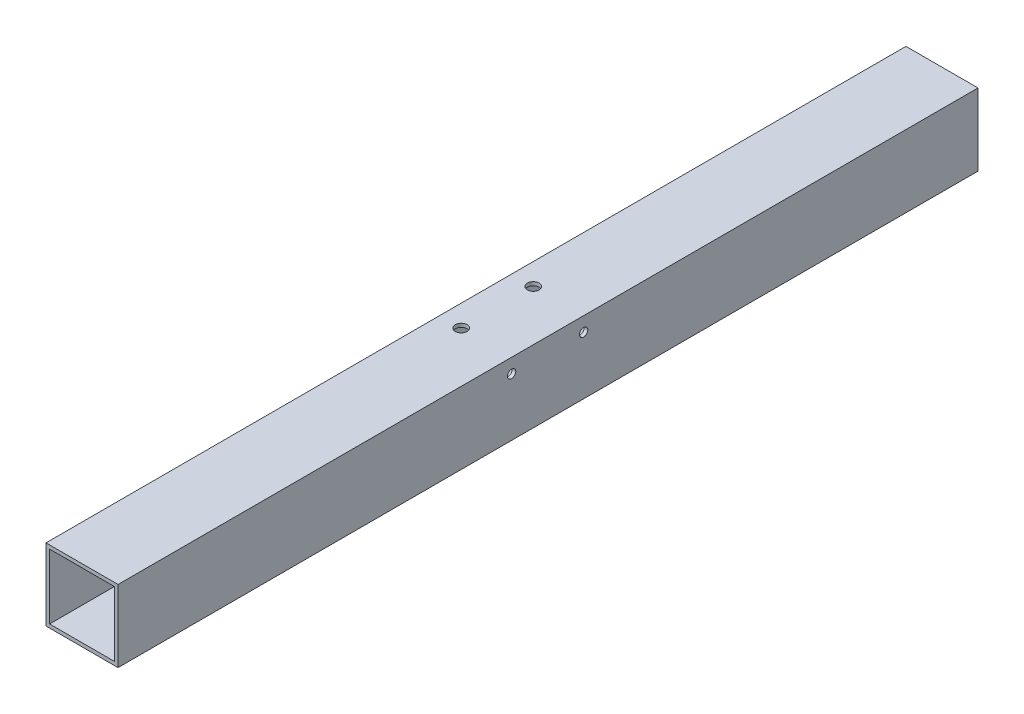
ISO-10303-21;
HEADER;
FILE_DESCRIPTION(('STEP AP214'),'2;1');
FILE_NAME('part.step','',(''),(''),'','','');
FILE_SCHEMA(('AUTOMOTIVE_DESIGN { 1 0 10303 214 1 1 1 1 }'));
ENDSEC;
DATA;
#1=APPLICATION_CONTEXT('core data for automotive mechanical design processes');
#2=APPLICATION_PROTOCOL_DEFINITION('international standard','automotive_design',2000,#1);
#3=PRODUCT_CONTEXT('',#1,'mechanical');
#4=PRODUCT('Part','Part','',(#3));
#5=PRODUCT_RELATED_PRODUCT_CATEGORY('part','',(#4));
#6=PRODUCT_DEFINITION_FORMATION('','',#4);
#7=PRODUCT_DEFINITION_CONTEXT('part definition',#1,'design');
#8=PRODUCT_DEFINITION('design','',#6,#7);
#9=PRODUCT_DEFINITION_SHAPE('','',#8);
#10=(LENGTH_UNIT() NAMED_UNIT(*) SI_UNIT(.MILLI.,.METRE.));
#11=(NAMED_UNIT(*) PLANE_ANGLE_UNIT() SI_UNIT($,.RADIAN.));
#12=(NAMED_UNIT(*) SI_UNIT($,.STERADIAN.) SOLID_ANGLE_UNIT());
#13=UNCERTAINTY_MEASURE_WITH_UNIT(LENGTH_MEASURE(1.E-05),#10,'distance_accuracy_value','');
#14=(GEOMETRIC_REPRESENTATION_CONTEXT(3) GLOBAL_UNCERTAINTY_ASSIGNED_CONTEXT((#13)) GLOBAL_UNIT_ASSIGNED_CONTEXT((#10,
#11,#12)) REPRESENTATION_CONTEXT('',''));
#15=CARTESIAN_POINT('',(0.,0.,0.));
#16=DIRECTION('',(0.,0.,1.));
#17=DIRECTION('',(1.,0.,0.));
#18=AXIS2_PLACEMENT_3D('',#15,#16,#17);
#19=CARTESIAN_POINT('',(0.,0.,238.73));
#20=DIRECTION('',(0.,0.,-1.));
#21=DIRECTION('',(-1.,0.,0.));
#22=AXIS2_PLACEMENT_3D('',#19,#20,#21);
#23=PLANE('',#22);
#24=DIRECTION('',(0.,1.,0.));
#25=VECTOR('',#24,1.);
#26=CARTESIAN_POINT('',(10.,-10.,238.73));
#27=LINE('',#26,#25);
#28=CARTESIAN_POINT('',(10.,-10.,238.73));
#29=VERTEX_POINT('',#28);
#30=CARTESIAN_POINT('',(10.,10.,238.73));
#31=VERTEX_POINT('',#30);
#32=EDGE_CURVE('E163',#29,#31,#27,.T.);
#33=ORIENTED_EDGE('',*,*,#32,.T.);
#34=DIRECTION('',(-1.,0.,0.));
#35=VECTOR('',#34,1.);
#36=CARTESIAN_POINT('',(-10.,10.,238.73));
#37=LINE('',#36,#35);
#38=CARTESIAN_POINT('',(-10.,10.,238.73));
#39=VERTEX_POINT('',#38);
#40=EDGE_CURVE('E167',#31,#39,#37,.T.);
#41=ORIENTED_EDGE('',*,*,#40,.T.);
#42=DIRECTION('',(0.,-1.,0.));
#43=VECTOR('',#42,1.);
#44=CARTESIAN_POINT('',(-10.,-10.,238.73));
#45=LINE('',#44,#43);
#46=CARTESIAN_POINT('',(-10.,-10.,238.73));
#47=VERTEX_POINT('',#46);
#48=EDGE_CURVE('E171',#39,#47,#45,.T.);
#49=ORIENTED_EDGE('',*,*,#48,.T.);
#50=DIRECTION('',(1.,0.,0.));
#51=VECTOR('',#50,1.);
#52=CARTESIAN_POINT('',(-10.,-10.,238.73));
#53=LINE('',#52,#51);
#54=EDGE_CURVE('E174',#47,#29,#53,.T.);
#55=ORIENTED_EDGE('',*,*,#54,.T.);
#56=EDGE_LOOP('',(#33,#41,#49,#55));
#57=FACE_BOUND('',#56,.T.);
#58=DIRECTION('',(0.,1.,0.));
#59=VECTOR('',#58,1.);
#60=CARTESIAN_POINT('',(9.,-9.,238.73));
#61=LINE('',#60,#59);
#62=CARTESIAN_POINT('',(9.,-9.,238.73));
#63=VERTEX_POINT('',#62);
#64=CARTESIAN_POINT('',(9.,9.,238.73));
#65=VERTEX_POINT('',#64);
#66=EDGE_CURVE('E113',#63,#65,#61,.T.);
#67=ORIENTED_EDGE('',*,*,#66,.F.);
#68=DIRECTION('',(1.,0.,0.));
#69=VECTOR('',#68,1.);
#70=CARTESIAN_POINT('',(-9.,-9.,238.73));
#71=LINE('',#70,#69);
#72=CARTESIAN_POINT('',(-9.,-9.,238.73));
#73=VERTEX_POINT('',#72);
#74=EDGE_CURVE('E139',#73,#63,#71,.T.);
#75=ORIENTED_EDGE('',*,*,#74,.F.);
#76=DIRECTION('',(0.,-1.,0.));
#77=VECTOR('',#76,1.);
#78=CARTESIAN_POINT('',(-9.,-9.,238.73));
#79=LINE('',#78,#77);
#80=CARTESIAN_POINT('',(-9.,9.,238.73));
#81=VERTEX_POINT('',#80);
#82=EDGE_CURVE('E135',#81,#73,#79,.T.);
#83=ORIENTED_EDGE('',*,*,#82,.F.);
#84=DIRECTION('',(-1.,0.,0.));
#85=VECTOR('',#84,1.);
#86=CARTESIAN_POINT('',(-9.,9.,238.73));
#87=LINE('',#86,#85);
#88=EDGE_CURVE('E122',#65,#81,#87,.T.);
#89=ORIENTED_EDGE('',*,*,#88,.F.);
#90=EDGE_LOOP('',(#67,#75,#83,#89));
#91=FACE_BOUND('',#90,.T.);
#92=ADVANCED_FACE('F45',(#57,#91),#23,.F.);
#93=CARTESIAN_POINT('',(0.,0.,0.));
#94=DIRECTION('',(0.,0.,-1.));
#95=DIRECTION('',(-1.,0.,0.));
#96=AXIS2_PLACEMENT_3D('',#93,#94,#95);
#97=PLANE('',#96);
#98=DIRECTION('',(0.,1.,0.));
#99=VECTOR('',#98,1.);
#100=CARTESIAN_POINT('',(10.,-10.,0.));
#101=LINE('',#100,#99);
#102=CARTESIAN_POINT('',(10.,-10.,0.));
#103=VERTEX_POINT('',#102);
#104=CARTESIAN_POINT('',(10.,10.,0.));
#105=VERTEX_POINT('',#104);
#106=EDGE_CURVE('E131',#103,#105,#101,.T.);
#107=ORIENTED_EDGE('',*,*,#106,.F.);
#108=DIRECTION('',(1.,0.,0.));
#109=VECTOR('',#108,1.);
#110=CARTESIAN_POINT('',(-10.,-10.,0.));
#111=LINE('',#110,#109);
#112=CARTESIAN_POINT('',(-10.,-10.,0.));
#113=VERTEX_POINT('',#112);
#114=EDGE_CURVE('E168',#113,#103,#111,.T.);
#115=ORIENTED_EDGE('',*,*,#114,.F.);
#116=DIRECTION('',(0.,-1.,0.));
#117=VECTOR('',#116,1.);
#118=CARTESIAN_POINT('',(-10.,-10.,0.));
#119=LINE('',#118,#117);
#120=CARTESIAN_POINT('',(-10.,10.,0.));
#121=VERTEX_POINT('',#120);
#122=EDGE_CURVE('E184',#121,#113,#119,.T.);
#123=ORIENTED_EDGE('',*,*,#122,.F.);
#124=DIRECTION('',(-1.,0.,0.));
#125=VECTOR('',#124,1.);
#126=CARTESIAN_POINT('',(-10.,10.,0.));
#127=LINE('',#126,#125);
#128=EDGE_CURVE('E181',#105,#121,#127,.T.);
#129=ORIENTED_EDGE('',*,*,#128,.F.);
#130=EDGE_LOOP('',(#107,#115,#123,#129));
#131=FACE_BOUND('',#130,.T.);
#132=DIRECTION('',(1.,0.,0.));
#133=VECTOR('',#132,1.);
#134=CARTESIAN_POINT('',(-9.,-9.,0.));
#135=LINE('',#134,#133);
#136=CARTESIAN_POINT('',(-9.,-9.,0.));
#137=VERTEX_POINT('',#136);
#138=CARTESIAN_POINT('',(9.,-9.,0.));
#139=VERTEX_POINT('',#138);
#140=EDGE_CURVE('E123',#137,#139,#135,.T.);
#141=ORIENTED_EDGE('',*,*,#140,.T.);
#142=DIRECTION('',(0.,1.,0.));
#143=VECTOR('',#142,1.);
#144=CARTESIAN_POINT('',(9.,-9.,0.));
#145=LINE('',#144,#143);
#146=CARTESIAN_POINT('',(9.,9.,0.));
#147=VERTEX_POINT('',#146);
#148=EDGE_CURVE('E71',#139,#147,#145,.T.);
#149=ORIENTED_EDGE('',*,*,#148,.T.);
#150=DIRECTION('',(-1.,0.,0.));
#151=VECTOR('',#150,1.);
#152=CARTESIAN_POINT('',(-9.,9.,0.));
#153=LINE('',#152,#151);
#154=CARTESIAN_POINT('',(-9.,9.,0.));
#155=VERTEX_POINT('',#154);
#156=EDGE_CURVE('E129',#147,#155,#153,.T.);
#157=ORIENTED_EDGE('',*,*,#156,.T.);
#158=DIRECTION('',(0.,-1.,0.));
#159=VECTOR('',#158,1.);
#160=CARTESIAN_POINT('',(-9.,-9.,0.));
#161=LINE('',#160,#159);
#162=EDGE_CURVE('E150',#155,#137,#161,.T.);
#163=ORIENTED_EDGE('',*,*,#162,.T.);
#164=EDGE_LOOP('',(#141,#149,#157,#163));
#165=FACE_BOUND('',#164,.T.);
#166=ADVANCED_FACE('F285',(#131,#165),#97,.T.);
#167=CARTESIAN_POINT('',(10.,-10.,238.73));
#168=DIRECTION('',(-1.,0.,0.));
#169=DIRECTION('',(0.,0.,1.));
#170=AXIS2_PLACEMENT_3D('',#167,#168,#169);
#171=PLANE('',#170);
#172=CARTESIAN_POINT('',(10.,6.,129.47));
#173=DIRECTION('',(-1.,0.,0.));
#174=DIRECTION('',(0.,0.,1.));
#175=AXIS2_PLACEMENT_3D('',#172,#173,#174);
#176=CIRCLE('',#175,1.15000000000002);
#177=CARTESIAN_POINT('',(10.,6.,130.62));
#178=VERTEX_POINT('',#177);
#179=EDGE_CURVE('E214',#178,#178,#176,.T.);
#180=ORIENTED_EDGE('',*,*,#179,.T.);
#181=EDGE_LOOP('',(#180));
#182=FACE_BOUND('',#181,.T.);
#183=CARTESIAN_POINT('',(10.,6.,109.47));
#184=DIRECTION('',(-1.,0.,0.));
#185=DIRECTION('',(0.,0.,1.));
#186=AXIS2_PLACEMENT_3D('',#183,#184,#185);
#187=CIRCLE('',#186,1.15);
#188=CARTESIAN_POINT('',(10.,6.,110.62));
#189=VERTEX_POINT('',#188);
#190=EDGE_CURVE('E223',#189,#189,#187,.T.);
#191=ORIENTED_EDGE('',*,*,#190,.T.);
#192=EDGE_LOOP('',(#191));
#193=FACE_BOUND('',#192,.T.);
#194=ORIENTED_EDGE('',*,*,#106,.T.);
#195=DIRECTION('',(0.,0.,-1.));
#196=VECTOR('',#195,1.);
#197=CARTESIAN_POINT('',(10.,10.,238.73));
#198=LINE('',#197,#196);
#199=EDGE_CURVE('E11',#31,#105,#198,.T.);
#200=ORIENTED_EDGE('',*,*,#199,.F.);
#201=ORIENTED_EDGE('',*,*,#32,.F.);
#202=DIRECTION('',(0.,0.,-1.));
#203=VECTOR('',#202,1.);
#204=CARTESIAN_POINT('',(10.,-10.,238.73));
#205=LINE('',#204,#203);
#206=EDGE_CURVE('E177',#29,#103,#205,.T.);
#207=ORIENTED_EDGE('',*,*,#206,.T.);
#208=EDGE_LOOP('',(#194,#200,#201,#207));
#209=FACE_BOUND('',#208,.T.);
#210=ADVANCED_FACE('F47',(#182,#193,#209),#171,.F.);
#211=CARTESIAN_POINT('',(-10.,10.,238.73));
#212=DIRECTION('',(0.,-1.,0.));
#213=DIRECTION('',(0.,0.,-1.));
#214=AXIS2_PLACEMENT_3D('',#211,#212,#213);
#215=PLANE('',#214);
#216=CARTESIAN_POINT('',(-4.,10.,109.46));
#217=DIRECTION('',(0.,-1.,0.));
#218=DIRECTION('',(0.,0.,-1.));
#219=AXIS2_PLACEMENT_3D('',#216,#217,#218);
#220=CIRCLE('',#219,1.65);
#221=CARTESIAN_POINT('',(-4.,10.,107.81));
#222=VERTEX_POINT('',#221);
#223=EDGE_CURVE('E147',#222,#222,#220,.T.);
#224=ORIENTED_EDGE('',*,*,#223,.T.);
#225=EDGE_LOOP('',(#224));
#226=FACE_BOUND('',#225,.T.);
#227=CARTESIAN_POINT('',(-4.,10.,129.46));
#228=DIRECTION('',(0.,-1.,0.));
#229=DIRECTION('',(0.,0.,-1.));
#230=AXIS2_PLACEMENT_3D('',#227,#228,#229);
#231=CIRCLE('',#230,1.65000000000001);
#232=CARTESIAN_POINT('',(-4.,10.,127.81));
#233=VERTEX_POINT('',#232);
#234=EDGE_CURVE('E209',#233,#233,#231,.T.);
#235=ORIENTED_EDGE('',*,*,#234,.T.);
#236=EDGE_LOOP('',(#235));
#237=FACE_BOUND('',#236,.T.);
#238=ORIENTED_EDGE('',*,*,#128,.T.);
#239=DIRECTION('',(0.,0.,-1.));
#240=VECTOR('',#239,1.);
#241=CARTESIAN_POINT('',(-10.,10.,238.73));
#242=LINE('',#241,#240);
#243=EDGE_CURVE('E55',#39,#121,#242,.T.);
#244=ORIENTED_EDGE('',*,*,#243,.F.);
#245=ORIENTED_EDGE('',*,*,#40,.F.);
#246=ORIENTED_EDGE('',*,*,#199,.T.);
#247=EDGE_LOOP('',(#238,#244,#245,#246));
#248=FACE_BOUND('',#247,.T.);
#249=ADVANCED_FACE('F261',(#226,#237,#248),#215,.F.);
#250=CARTESIAN_POINT('',(-10.,-10.,238.73));
#251=DIRECTION('',(1.,0.,0.));
#252=DIRECTION('',(0.,0.,-1.));
#253=AXIS2_PLACEMENT_3D('',#250,#251,#252);
#254=PLANE('',#253);
#255=CARTESIAN_POINT('',(-10.,6.,129.47));
#256=DIRECTION('',(1.,0.,0.));
#257=DIRECTION('',(0.,0.,-1.));
#258=AXIS2_PLACEMENT_3D('',#255,#256,#257);
#259=CIRCLE('',#258,1.15000000000002);
#260=CARTESIAN_POINT('',(-10.,6.,128.32));
#261=VERTEX_POINT('',#260);
#262=EDGE_CURVE('E238',#261,#261,#259,.T.);
#263=ORIENTED_EDGE('',*,*,#262,.T.);
#264=EDGE_LOOP('',(#263));
#265=FACE_BOUND('',#264,.T.);
#266=CARTESIAN_POINT('',(-10.,6.,109.47));
#267=DIRECTION('',(1.,0.,0.));
#268=DIRECTION('',(0.,0.,-1.));
#269=AXIS2_PLACEMENT_3D('',#266,#267,#268);
#270=CIRCLE('',#269,1.15);
#271=CARTESIAN_POINT('',(-10.,6.,108.32));
#272=VERTEX_POINT('',#271);
#273=EDGE_CURVE('E220',#272,#272,#270,.T.);
#274=ORIENTED_EDGE('',*,*,#273,.T.);
#275=EDGE_LOOP('',(#274));
#276=FACE_BOUND('',#275,.T.);
#277=ORIENTED_EDGE('',*,*,#122,.T.);
#278=DIRECTION('',(0.,0.,-1.));
#279=VECTOR('',#278,1.);
#280=CARTESIAN_POINT('',(-10.,-10.,238.73));
#281=LINE('',#280,#279);
#282=EDGE_CURVE('E192',#47,#113,#281,.T.);
#283=ORIENTED_EDGE('',*,*,#282,.F.);
#284=ORIENTED_EDGE('',*,*,#48,.F.);
#285=ORIENTED_EDGE('',*,*,#243,.T.);
#286=EDGE_LOOP('',(#277,#283,#284,#285));
#287=FACE_BOUND('',#286,.T.);
#288=ADVANCED_FACE('F299',(#265,#276,#287),#254,.F.);
#289=CARTESIAN_POINT('',(-10.,-10.,238.73));
#290=DIRECTION('',(0.,1.,0.));
#291=DIRECTION('',(0.,0.,1.));
#292=AXIS2_PLACEMENT_3D('',#289,#290,#291);
#293=PLANE('',#292);
#294=CARTESIAN_POINT('',(-4.,-10.,109.46));
#295=DIRECTION('',(0.,1.,0.));
#296=DIRECTION('',(0.,0.,1.));
#297=AXIS2_PLACEMENT_3D('',#294,#295,#296);
#298=CIRCLE('',#297,1.65);
#299=CARTESIAN_POINT('',(-4.,-10.,111.11));
#300=VERTEX_POINT('',#299);
#301=EDGE_CURVE('E204',#300,#300,#298,.T.);
#302=ORIENTED_EDGE('',*,*,#301,.T.);
#303=EDGE_LOOP('',(#302));
#304=FACE_BOUND('',#303,.T.);
#305=CARTESIAN_POINT('',(-4.,-10.,129.46));
#306=DIRECTION('',(0.,1.,0.));
#307=DIRECTION('',(0.,0.,1.));
#308=AXIS2_PLACEMENT_3D('',#305,#306,#307);
#309=CIRCLE('',#308,1.65000000000001);
#310=CARTESIAN_POINT('',(-4.,-10.,131.11));
#311=VERTEX_POINT('',#310);
#312=EDGE_CURVE('E242',#311,#311,#309,.T.);
#313=ORIENTED_EDGE('',*,*,#312,.T.);
#314=EDGE_LOOP('',(#313));
#315=FACE_BOUND('',#314,.T.);
#316=ORIENTED_EDGE('',*,*,#114,.T.);
#317=ORIENTED_EDGE('',*,*,#206,.F.);
#318=ORIENTED_EDGE('',*,*,#54,.F.);
#319=ORIENTED_EDGE('',*,*,#282,.T.);
#320=EDGE_LOOP('',(#316,#317,#318,#319));
#321=FACE_BOUND('',#320,.T.);
#322=ADVANCED_FACE('F296',(#304,#315,#321),#293,.F.);
#323=CARTESIAN_POINT('',(9.,-9.,238.73));
#324=DIRECTION('',(-1.,0.,0.));
#325=DIRECTION('',(0.,0.,1.));
#326=AXIS2_PLACEMENT_3D('',#323,#324,#325);
#327=PLANE('',#326);
#328=CARTESIAN_POINT('',(9.,6.,129.47));
#329=DIRECTION('',(-1.,0.,0.));
#330=DIRECTION('',(0.,0.,1.));
#331=AXIS2_PLACEMENT_3D('',#328,#329,#330);
#332=CIRCLE('',#331,1.15000000000002);
#333=CARTESIAN_POINT('',(9.,6.,130.62));
#334=VERTEX_POINT('',#333);
#335=EDGE_CURVE('E234',#334,#334,#332,.T.);
#336=ORIENTED_EDGE('',*,*,#335,.F.);
#337=EDGE_LOOP('',(#336));
#338=FACE_BOUND('',#337,.T.);
#339=CARTESIAN_POINT('',(9.,6.,109.47));
#340=DIRECTION('',(-1.,0.,0.));
#341=DIRECTION('',(0.,0.,1.));
#342=AXIS2_PLACEMENT_3D('',#339,#340,#341);
#343=CIRCLE('',#342,1.15);
#344=CARTESIAN_POINT('',(9.,6.,110.62));
#345=VERTEX_POINT('',#344);
#346=EDGE_CURVE('E213',#345,#345,#343,.T.);
#347=ORIENTED_EDGE('',*,*,#346,.F.);
#348=EDGE_LOOP('',(#347));
#349=FACE_BOUND('',#348,.T.);
#350=ORIENTED_EDGE('',*,*,#148,.F.);
#351=DIRECTION('',(0.,0.,-1.));
#352=VECTOR('',#351,1.);
#353=CARTESIAN_POINT('',(9.,-9.,238.73));
#354=LINE('',#353,#352);
#355=EDGE_CURVE('E117',#63,#139,#354,.T.);
#356=ORIENTED_EDGE('',*,*,#355,.F.);
#357=ORIENTED_EDGE('',*,*,#66,.T.);
#358=DIRECTION('',(0.,0.,-1.));
#359=VECTOR('',#358,1.);
#360=CARTESIAN_POINT('',(9.,9.,238.73));
#361=LINE('',#360,#359);
#362=EDGE_CURVE('E116',#65,#147,#361,.T.);
#363=ORIENTED_EDGE('',*,*,#362,.T.);
#364=EDGE_LOOP('',(#350,#356,#357,#363));
#365=FACE_BOUND('',#364,.T.);
#366=ADVANCED_FACE('F115',(#338,#349,#365),#327,.T.);
#367=CARTESIAN_POINT('',(-9.,9.,238.73));
#368=DIRECTION('',(0.,-1.,0.));
#369=DIRECTION('',(0.,0.,-1.));
#370=AXIS2_PLACEMENT_3D('',#367,#368,#369);
#371=PLANE('',#370);
#372=CARTESIAN_POINT('',(-4.,9.,109.46));
#373=DIRECTION('',(0.,-1.,0.));
#374=DIRECTION('',(0.,0.,-1.));
#375=AXIS2_PLACEMENT_3D('',#372,#373,#374);
#376=CIRCLE('',#375,1.65);
#377=CARTESIAN_POINT('',(-4.,9.,107.81));
#378=VERTEX_POINT('',#377);
#379=EDGE_CURVE('E208',#378,#378,#376,.T.);
#380=ORIENTED_EDGE('',*,*,#379,.F.);
#381=EDGE_LOOP('',(#380));
#382=FACE_BOUND('',#381,.T.);
#383=CARTESIAN_POINT('',(-4.,9.,129.46));
#384=DIRECTION('',(0.,-1.,0.));
#385=DIRECTION('',(0.,0.,-1.));
#386=AXIS2_PLACEMENT_3D('',#383,#384,#385);
#387=CIRCLE('',#386,1.65000000000001);
#388=CARTESIAN_POINT('',(-4.,9.,127.81));
#389=VERTEX_POINT('',#388);
#390=EDGE_CURVE('E203',#389,#389,#387,.T.);
#391=ORIENTED_EDGE('',*,*,#390,.F.);
#392=EDGE_LOOP('',(#391));
#393=FACE_BOUND('',#392,.T.);
#394=ORIENTED_EDGE('',*,*,#156,.F.);
#395=ORIENTED_EDGE('',*,*,#362,.F.);
#396=ORIENTED_EDGE('',*,*,#88,.T.);
#397=DIRECTION('',(0.,0.,-1.));
#398=VECTOR('',#397,1.);
#399=CARTESIAN_POINT('',(-9.,9.,238.73));
#400=LINE('',#399,#398);
#401=EDGE_CURVE('E132',#81,#155,#400,.T.);
#402=ORIENTED_EDGE('',*,*,#401,.T.);
#403=EDGE_LOOP('',(#394,#395,#396,#402));
#404=FACE_BOUND('',#403,.T.);
#405=ADVANCED_FACE('F126',(#382,#393,#404),#371,.T.);
#406=CARTESIAN_POINT('',(-9.,-9.,238.73));
#407=DIRECTION('',(1.,0.,0.));
#408=DIRECTION('',(0.,0.,-1.));
#409=AXIS2_PLACEMENT_3D('',#406,#407,#408);
#410=PLANE('',#409);
#411=CARTESIAN_POINT('',(-9.,6.,129.47));
#412=DIRECTION('',(1.,0.,0.));
#413=DIRECTION('',(0.,0.,-1.));
#414=AXIS2_PLACEMENT_3D('',#411,#412,#413);
#415=CIRCLE('',#414,1.15000000000002);
#416=CARTESIAN_POINT('',(-9.,6.,128.32));
#417=VERTEX_POINT('',#416);
#418=EDGE_CURVE('E49',#417,#417,#415,.T.);
#419=ORIENTED_EDGE('',*,*,#418,.F.);
#420=EDGE_LOOP('',(#419));
#421=FACE_BOUND('',#420,.T.);
#422=CARTESIAN_POINT('',(-9.,6.,109.47));
#423=DIRECTION('',(1.,0.,0.));
#424=DIRECTION('',(0.,0.,-1.));
#425=AXIS2_PLACEMENT_3D('',#422,#423,#424);
#426=CIRCLE('',#425,1.15);
#427=CARTESIAN_POINT('',(-9.,6.,108.32));
#428=VERTEX_POINT('',#427);
#429=EDGE_CURVE('E210',#428,#428,#426,.T.);
#430=ORIENTED_EDGE('',*,*,#429,.F.);
#431=EDGE_LOOP('',(#430));
#432=FACE_BOUND('',#431,.T.);
#433=ORIENTED_EDGE('',*,*,#162,.F.);
#434=ORIENTED_EDGE('',*,*,#401,.F.);
#435=ORIENTED_EDGE('',*,*,#82,.T.);
#436=DIRECTION('',(0.,0.,-1.));
#437=VECTOR('',#436,1.);
#438=CARTESIAN_POINT('',(-9.,-9.,238.73));
#439=LINE('',#438,#437);
#440=EDGE_CURVE('E63',#73,#137,#439,.T.);
#441=ORIENTED_EDGE('',*,*,#440,.T.);
#442=EDGE_LOOP('',(#433,#434,#435,#441));
#443=FACE_BOUND('',#442,.T.);
#444=ADVANCED_FACE('F328',(#421,#432,#443),#410,.T.);
#445=CARTESIAN_POINT('',(-9.,-9.,238.73));
#446=DIRECTION('',(0.,1.,0.));
#447=DIRECTION('',(0.,0.,1.));
#448=AXIS2_PLACEMENT_3D('',#445,#446,#447);
#449=PLANE('',#448);
#450=CARTESIAN_POINT('',(-4.,-9.,109.46));
#451=DIRECTION('',(0.,1.,0.));
#452=DIRECTION('',(0.,0.,1.));
#453=AXIS2_PLACEMENT_3D('',#450,#451,#452);
#454=CIRCLE('',#453,1.65);
#455=CARTESIAN_POINT('',(-4.,-9.,111.11));
#456=VERTEX_POINT('',#455);
#457=EDGE_CURVE('E205',#456,#456,#454,.T.);
#458=ORIENTED_EDGE('',*,*,#457,.F.);
#459=EDGE_LOOP('',(#458));
#460=FACE_BOUND('',#459,.T.);
#461=CARTESIAN_POINT('',(-4.,-9.,129.46));
#462=DIRECTION('',(0.,1.,0.));
#463=DIRECTION('',(0.,0.,1.));
#464=AXIS2_PLACEMENT_3D('',#461,#462,#463);
#465=CIRCLE('',#464,1.65000000000001);
#466=CARTESIAN_POINT('',(-4.,-9.,131.11));
#467=VERTEX_POINT('',#466);
#468=EDGE_CURVE('E199',#467,#467,#465,.T.);
#469=ORIENTED_EDGE('',*,*,#468,.F.);
#470=EDGE_LOOP('',(#469));
#471=FACE_BOUND('',#470,.T.);
#472=ORIENTED_EDGE('',*,*,#140,.F.);
#473=ORIENTED_EDGE('',*,*,#440,.F.);
#474=ORIENTED_EDGE('',*,*,#74,.T.);
#475=ORIENTED_EDGE('',*,*,#355,.T.);
#476=EDGE_LOOP('',(#472,#473,#474,#475));
#477=FACE_BOUND('',#476,.T.);
#478=ADVANCED_FACE('F326',(#460,#471,#477),#449,.T.);
#479=CARTESIAN_POINT('',(-4.,-10.,129.46));
#480=DIRECTION('',(0.,1.,0.));
#481=DIRECTION('',(0.,0.,1.));
#482=AXIS2_PLACEMENT_3D('',#479,#480,#481);
#483=CYLINDRICAL_SURFACE('',#482,1.65000000000001);
#484=ORIENTED_EDGE('',*,*,#468,.T.);
#485=EDGE_LOOP('',(#484));
#486=FACE_BOUND('',#485,.T.);
#487=ORIENTED_EDGE('',*,*,#312,.F.);
#488=EDGE_LOOP('',(#487));
#489=FACE_BOUND('',#488,.T.);
#490=ADVANCED_FACE('F281',(#486,#489),#483,.F.);
#491=CARTESIAN_POINT('',(-4.,-10.,109.46));
#492=DIRECTION('',(0.,1.,0.));
#493=DIRECTION('',(0.,0.,1.));
#494=AXIS2_PLACEMENT_3D('',#491,#492,#493);
#495=CYLINDRICAL_SURFACE('',#494,1.65);
#496=ORIENTED_EDGE('',*,*,#457,.T.);
#497=EDGE_LOOP('',(#496));
#498=FACE_BOUND('',#497,.T.);
#499=ORIENTED_EDGE('',*,*,#301,.F.);
#500=EDGE_LOOP('',(#499));
#501=FACE_BOUND('',#500,.T.);
#502=ADVANCED_FACE('F270',(#498,#501),#495,.F.);
#503=ORIENTED_EDGE('',*,*,#390,.T.);
#504=EDGE_LOOP('',(#503));
#505=FACE_BOUND('',#504,.T.);
#506=ORIENTED_EDGE('',*,*,#234,.F.);
#507=EDGE_LOOP('',(#506));
#508=FACE_BOUND('',#507,.T.);
#509=ADVANCED_FACE('F267',(#505,#508),#483,.F.);
#510=ORIENTED_EDGE('',*,*,#379,.T.);
#511=EDGE_LOOP('',(#510));
#512=FACE_BOUND('',#511,.T.);
#513=ORIENTED_EDGE('',*,*,#223,.F.);
#514=EDGE_LOOP('',(#513));
#515=FACE_BOUND('',#514,.T.);
#516=ADVANCED_FACE('F264',(#512,#515),#495,.F.);
#517=CARTESIAN_POINT('',(10.,6.,109.47));
#518=DIRECTION('',(-1.,0.,0.));
#519=DIRECTION('',(0.,0.,1.));
#520=AXIS2_PLACEMENT_3D('',#517,#518,#519);
#521=CYLINDRICAL_SURFACE('',#520,1.15);
#522=ORIENTED_EDGE('',*,*,#429,.T.);
#523=EDGE_LOOP('',(#522));
#524=FACE_BOUND('',#523,.T.);
#525=ORIENTED_EDGE('',*,*,#273,.F.);
#526=EDGE_LOOP('',(#525));
#527=FACE_BOUND('',#526,.T.);
#528=ADVANCED_FACE('F266',(#524,#527),#521,.F.);
#529=CARTESIAN_POINT('',(10.,6.,129.47));
#530=DIRECTION('',(-1.,0.,0.));
#531=DIRECTION('',(0.,0.,1.));
#532=AXIS2_PLACEMENT_3D('',#529,#530,#531);
#533=CYLINDRICAL_SURFACE('',#532,1.15000000000002);
#534=ORIENTED_EDGE('',*,*,#418,.T.);
#535=EDGE_LOOP('',(#534));
#536=FACE_BOUND('',#535,.T.);
#537=ORIENTED_EDGE('',*,*,#262,.F.);
#538=EDGE_LOOP('',(#537));
#539=FACE_BOUND('',#538,.T.);
#540=ADVANCED_FACE('F276',(#536,#539),#533,.F.);
#541=ORIENTED_EDGE('',*,*,#346,.T.);
#542=EDGE_LOOP('',(#541));
#543=FACE_BOUND('',#542,.T.);
#544=ORIENTED_EDGE('',*,*,#190,.F.);
#545=EDGE_LOOP('',(#544));
#546=FACE_BOUND('',#545,.T.);
#547=ADVANCED_FACE('F278',(#543,#546),#521,.F.);
#548=ORIENTED_EDGE('',*,*,#335,.T.);
#549=EDGE_LOOP('',(#548));
#550=FACE_BOUND('',#549,.T.);
#551=ORIENTED_EDGE('',*,*,#179,.F.);
#552=EDGE_LOOP('',(#551));
#553=FACE_BOUND('',#552,.T.);
#554=ADVANCED_FACE('F359',(#550,#553),#533,.F.);
#555=CLOSED_SHELL('',(#92,#166,#210,#249,#288,#322,#366,#405,#444,#478,#490,#502,#509,#516,#528,
#540,#547,#554));
#556=MANIFOLD_SOLID_BREP('B2',#555);
#557=ADVANCED_BREP_SHAPE_REPRESENTATION('',(#18,#556),#14);
#558=SHAPE_DEFINITION_REPRESENTATION(#9,#557);
ENDSEC;
END-ISO-10303-21;
